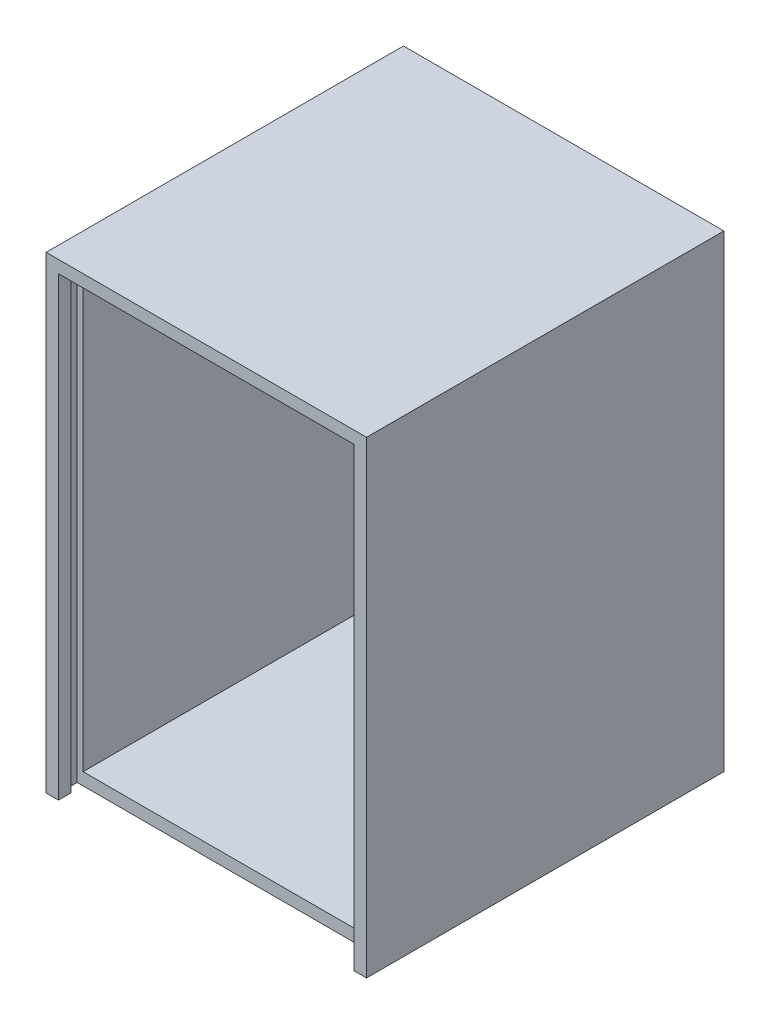
ISO-10303-21;
HEADER;
FILE_DESCRIPTION(('STEP AP214'),'2;1');
FILE_NAME('part.step','',(''),(''),'','','');
FILE_SCHEMA(('AUTOMOTIVE_DESIGN { 1 0 10303 214 1 1 1 1 }'));
ENDSEC;
DATA;
#1=APPLICATION_CONTEXT('core data for automotive mechanical design processes');
#2=APPLICATION_PROTOCOL_DEFINITION('international standard','automotive_design',2000,#1);
#3=PRODUCT_CONTEXT('',#1,'mechanical');
#4=PRODUCT('Part','Part','',(#3));
#5=PRODUCT_RELATED_PRODUCT_CATEGORY('part','',(#4));
#6=PRODUCT_DEFINITION_FORMATION('','',#4);
#7=PRODUCT_DEFINITION_CONTEXT('part definition',#1,'design');
#8=PRODUCT_DEFINITION('design','',#6,#7);
#9=PRODUCT_DEFINITION_SHAPE('','',#8);
#10=(LENGTH_UNIT() NAMED_UNIT(*) SI_UNIT(.MILLI.,.METRE.));
#11=(NAMED_UNIT(*) PLANE_ANGLE_UNIT() SI_UNIT($,.RADIAN.));
#12=(NAMED_UNIT(*) SI_UNIT($,.STERADIAN.) SOLID_ANGLE_UNIT());
#13=UNCERTAINTY_MEASURE_WITH_UNIT(LENGTH_MEASURE(1.E-05),#10,'distance_accuracy_value','');
#14=(GEOMETRIC_REPRESENTATION_CONTEXT(3) GLOBAL_UNCERTAINTY_ASSIGNED_CONTEXT((#13)) GLOBAL_UNIT_ASSIGNED_CONTEXT((#10,
#11,#12)) REPRESENTATION_CONTEXT('',''));
#15=CARTESIAN_POINT('',(0.,0.,0.));
#16=DIRECTION('',(0.,0.,1.));
#17=DIRECTION('',(1.,0.,0.));
#18=AXIS2_PLACEMENT_3D('',#15,#16,#17);
#19=CARTESIAN_POINT('',(5.00000000000002,-5.,135.));
#20=DIRECTION('',(0.,-1.,0.));
#21=DIRECTION('',(1.,0.,0.));
#22=AXIS2_PLACEMENT_3D('',#19,#20,#21);
#23=PLANE('',#22);
#24=DIRECTION('',(-1.,0.,0.));
#25=VECTOR('',#24,1.);
#26=CARTESIAN_POINT('',(5.00000000000003,-5.,140.));
#27=LINE('',#26,#25);
#28=CARTESIAN_POINT('',(125.,-5.,140.));
#29=VERTEX_POINT('',#28);
#30=CARTESIAN_POINT('',(5.00000000000003,-5.,140.));
#31=VERTEX_POINT('',#30);
#32=EDGE_CURVE('E163',#29,#31,#27,.T.);
#33=ORIENTED_EDGE('',*,*,#32,.F.);
#34=DIRECTION('',(0.,0.,-1.));
#35=VECTOR('',#34,1.);
#36=CARTESIAN_POINT('',(125.,-5.,135.));
#37=LINE('',#36,#35);
#38=CARTESIAN_POINT('',(125.,-5.,145.));
#39=VERTEX_POINT('',#38);
#40=EDGE_CURVE('E187',#39,#29,#37,.T.);
#41=ORIENTED_EDGE('',*,*,#40,.F.);
#42=DIRECTION('',(1.,0.,0.));
#43=VECTOR('',#42,1.);
#44=CARTESIAN_POINT('',(125.,-5.,145.));
#45=LINE('',#44,#43);
#46=CARTESIAN_POINT('',(5.00000000000002,-5.,145.));
#47=VERTEX_POINT('',#46);
#48=EDGE_CURVE('E344',#47,#39,#45,.T.);
#49=ORIENTED_EDGE('',*,*,#48,.F.);
#50=DIRECTION('',(0.,0.,-1.));
#51=VECTOR('',#50,1.);
#52=CARTESIAN_POINT('',(5.00000000000002,-5.,135.));
#53=LINE('',#52,#51);
#54=EDGE_CURVE('E177',#47,#31,#53,.T.);
#55=ORIENTED_EDGE('',*,*,#54,.T.);
#56=EDGE_LOOP('',(#33,#41,#49,#55));
#57=FACE_BOUND('',#56,.T.);
#58=ADVANCED_FACE('F45',(#57),#23,.T.);
#59=CARTESIAN_POINT('',(125.,-185.,135.));
#60=DIRECTION('',(-1.,0.,0.));
#61=DIRECTION('',(0.,0.,1.));
#62=AXIS2_PLACEMENT_3D('',#59,#60,#61);
#63=PLANE('',#62);
#64=DIRECTION('',(0.,-1.,0.));
#65=VECTOR('',#64,1.);
#66=CARTESIAN_POINT('',(125.,-2.59999999999999,140.));
#67=LINE('',#66,#65);
#68=CARTESIAN_POINT('',(125.,-190.,140.));
#69=VERTEX_POINT('',#68);
#70=EDGE_CURVE('E378',#29,#69,#67,.T.);
#71=ORIENTED_EDGE('',*,*,#70,.T.);
#72=DIRECTION('',(0.,0.,-1.));
#73=VECTOR('',#72,1.);
#74=CARTESIAN_POINT('',(125.,-190.,145.));
#75=LINE('',#74,#73);
#76=CARTESIAN_POINT('',(125.,-190.,145.));
#77=VERTEX_POINT('',#76);
#78=EDGE_CURVE('E249',#77,#69,#75,.T.);
#79=ORIENTED_EDGE('',*,*,#78,.F.);
#80=DIRECTION('',(0.,-1.,0.));
#81=VECTOR('',#80,1.);
#82=CARTESIAN_POINT('',(125.,-185.,145.));
#83=LINE('',#82,#81);
#84=EDGE_CURVE('E356',#39,#77,#83,.T.);
#85=ORIENTED_EDGE('',*,*,#84,.F.);
#86=ORIENTED_EDGE('',*,*,#40,.T.);
#87=EDGE_LOOP('',(#71,#79,#85,#86));
#88=FACE_BOUND('',#87,.T.);
#89=ADVANCED_FACE('F294',(#88),#63,.T.);
#90=CARTESIAN_POINT('',(5.00000000000002,-185.,135.));
#91=DIRECTION('',(1.,0.,0.));
#92=DIRECTION('',(0.,0.,-1.));
#93=AXIS2_PLACEMENT_3D('',#90,#91,#92);
#94=PLANE('',#93);
#95=DIRECTION('',(0.,1.,0.));
#96=VECTOR('',#95,1.);
#97=CARTESIAN_POINT('',(5.00000000000002,-185.,135.));
#98=LINE('',#97,#96);
#99=CARTESIAN_POINT('',(5.00000000000003,-185.,135.));
#100=VERTEX_POINT('',#99);
#101=CARTESIAN_POINT('',(5.00000000000003,-5.,135.));
#102=VERTEX_POINT('',#101);
#103=EDGE_CURVE('E11',#100,#102,#98,.T.);
#104=ORIENTED_EDGE('',*,*,#103,.F.);
#105=DIRECTION('',(0.,0.,-1.));
#106=VECTOR('',#105,1.);
#107=CARTESIAN_POINT('',(5.00000000000002,-185.,135.));
#108=LINE('',#107,#106);
#109=CARTESIAN_POINT('',(5.00000000000002,-185.,5.));
#110=VERTEX_POINT('',#109);
#111=EDGE_CURVE('E178',#100,#110,#108,.T.);
#112=ORIENTED_EDGE('',*,*,#111,.T.);
#113=DIRECTION('',(0.,-1.,0.));
#114=VECTOR('',#113,1.);
#115=CARTESIAN_POINT('',(5.00000000000002,-185.,5.));
#116=LINE('',#115,#114);
#117=CARTESIAN_POINT('',(5.00000000000002,-5.,5.));
#118=VERTEX_POINT('',#117);
#119=EDGE_CURVE('E175',#118,#110,#116,.T.);
#120=ORIENTED_EDGE('',*,*,#119,.F.);
#121=EDGE_CURVE('E69',#102,#118,#53,.T.);
#122=ORIENTED_EDGE('',*,*,#121,.F.);
#123=EDGE_LOOP('',(#104,#112,#120,#122));
#124=FACE_BOUND('',#123,.T.);
#125=ADVANCED_FACE('F174',(#124),#94,.T.);
#126=CARTESIAN_POINT('',(0.,0.,5.));
#127=DIRECTION('',(1.,0.,0.));
#128=DIRECTION('',(0.,1.,0.));
#129=AXIS2_PLACEMENT_3D('',#126,#127,#128);
#130=PLANE('',#129);
#131=DIRECTION('',(0.,-1.,0.));
#132=VECTOR('',#131,1.);
#133=CARTESIAN_POINT('',(0.,0.,0.));
#134=LINE('',#133,#132);
#135=CARTESIAN_POINT('',(0.,0.,0.));
#136=VERTEX_POINT('',#135);
#137=CARTESIAN_POINT('',(0.,-190.,0.));
#138=VERTEX_POINT('',#137);
#139=EDGE_CURVE('E194',#136,#138,#134,.T.);
#140=ORIENTED_EDGE('',*,*,#139,.T.);
#141=DIRECTION('',(0.,0.,-1.));
#142=VECTOR('',#141,1.);
#143=CARTESIAN_POINT('',(0.,-190.,5.));
#144=LINE('',#143,#142);
#145=CARTESIAN_POINT('',(0.,-190.,145.));
#146=VERTEX_POINT('',#145);
#147=EDGE_CURVE('E219',#146,#138,#144,.T.);
#148=ORIENTED_EDGE('',*,*,#147,.F.);
#149=DIRECTION('',(0.,-1.,0.));
#150=VECTOR('',#149,1.);
#151=CARTESIAN_POINT('',(0.,-190.,145.));
#152=LINE('',#151,#150);
#153=CARTESIAN_POINT('',(0.,0.,145.));
#154=VERTEX_POINT('',#153);
#155=EDGE_CURVE('E256',#154,#146,#152,.T.);
#156=ORIENTED_EDGE('',*,*,#155,.F.);
#157=DIRECTION('',(0.,0.,-1.));
#158=VECTOR('',#157,1.);
#159=CARTESIAN_POINT('',(0.,0.,5.));
#160=LINE('',#159,#158);
#161=EDGE_CURVE('E207',#154,#136,#160,.T.);
#162=ORIENTED_EDGE('',*,*,#161,.T.);
#163=EDGE_LOOP('',(#140,#148,#156,#162));
#164=FACE_BOUND('',#163,.T.);
#165=ADVANCED_FACE('F47',(#164),#130,.F.);
#166=CARTESIAN_POINT('',(0.,-190.,5.));
#167=DIRECTION('',(0.,1.,0.));
#168=DIRECTION('',(0.,0.,1.));
#169=AXIS2_PLACEMENT_3D('',#166,#167,#168);
#170=PLANE('',#169);
#171=DIRECTION('',(1.,0.,0.));
#172=VECTOR('',#171,1.);
#173=CARTESIAN_POINT('',(0.,-190.,135.));
#174=LINE('',#173,#172);
#175=CARTESIAN_POINT('',(2.60000000000003,-190.,135.));
#176=VERTEX_POINT('',#175);
#177=CARTESIAN_POINT('',(127.4,-190.,135.));
#178=VERTEX_POINT('',#177);
#179=EDGE_CURVE('E191',#176,#178,#174,.T.);
#180=ORIENTED_EDGE('',*,*,#179,.F.);
#181=DIRECTION('',(0.,0.,-1.));
#182=VECTOR('',#181,1.);
#183=CARTESIAN_POINT('',(2.60000000000003,-190.,140.));
#184=LINE('',#183,#182);
#185=CARTESIAN_POINT('',(2.60000000000003,-190.,140.));
#186=VERTEX_POINT('',#185);
#187=EDGE_CURVE('E239',#186,#176,#184,.T.);
#188=ORIENTED_EDGE('',*,*,#187,.F.);
#189=DIRECTION('',(-1.,0.,0.));
#190=VECTOR('',#189,1.);
#191=CARTESIAN_POINT('',(5.00000000000002,-190.,140.));
#192=LINE('',#191,#190);
#193=CARTESIAN_POINT('',(5.00000000000002,-190.,140.));
#194=VERTEX_POINT('',#193);
#195=EDGE_CURVE('E228',#194,#186,#192,.T.);
#196=ORIENTED_EDGE('',*,*,#195,.F.);
#197=DIRECTION('',(0.,0.,-1.));
#198=VECTOR('',#197,1.);
#199=CARTESIAN_POINT('',(5.00000000000002,-190.,145.));
#200=LINE('',#199,#198);
#201=CARTESIAN_POINT('',(5.00000000000002,-190.,145.));
#202=VERTEX_POINT('',#201);
#203=EDGE_CURVE('E237',#202,#194,#200,.T.);
#204=ORIENTED_EDGE('',*,*,#203,.F.);
#205=DIRECTION('',(1.,0.,0.));
#206=VECTOR('',#205,1.);
#207=CARTESIAN_POINT('',(5.00000000000002,-190.,145.));
#208=LINE('',#207,#206);
#209=EDGE_CURVE('E338',#146,#202,#208,.T.);
#210=ORIENTED_EDGE('',*,*,#209,.F.);
#211=ORIENTED_EDGE('',*,*,#147,.T.);
#212=DIRECTION('',(1.,0.,0.));
#213=VECTOR('',#212,1.);
#214=CARTESIAN_POINT('',(0.,-190.,0.));
#215=LINE('',#214,#213);
#216=CARTESIAN_POINT('',(130.,-190.,0.));
#217=VERTEX_POINT('',#216);
#218=EDGE_CURVE('E198',#138,#217,#215,.T.);
#219=ORIENTED_EDGE('',*,*,#218,.T.);
#220=DIRECTION('',(0.,0.,-1.));
#221=VECTOR('',#220,1.);
#222=CARTESIAN_POINT('',(130.,-190.,5.));
#223=LINE('',#222,#221);
#224=CARTESIAN_POINT('',(130.,-190.,145.));
#225=VERTEX_POINT('',#224);
#226=EDGE_CURVE('E215',#225,#217,#223,.T.);
#227=ORIENTED_EDGE('',*,*,#226,.F.);
#228=DIRECTION('',(1.,0.,0.));
#229=VECTOR('',#228,1.);
#230=CARTESIAN_POINT('',(130.,-190.,145.));
#231=LINE('',#230,#229);
#232=EDGE_CURVE('E359',#77,#225,#231,.T.);
#233=ORIENTED_EDGE('',*,*,#232,.F.);
#234=ORIENTED_EDGE('',*,*,#78,.T.);
#235=DIRECTION('',(-1.,0.,0.));
#236=VECTOR('',#235,1.);
#237=CARTESIAN_POINT('',(125.,-190.,140.));
#238=LINE('',#237,#236);
#239=CARTESIAN_POINT('',(127.4,-190.,140.));
#240=VERTEX_POINT('',#239);
#241=EDGE_CURVE('E381',#240,#69,#238,.T.);
#242=ORIENTED_EDGE('',*,*,#241,.F.);
#243=DIRECTION('',(0.,0.,1.));
#244=VECTOR('',#243,1.);
#245=CARTESIAN_POINT('',(127.4,-190.,135.));
#246=LINE('',#245,#244);
#247=EDGE_CURVE('E241',#178,#240,#246,.T.);
#248=ORIENTED_EDGE('',*,*,#247,.F.);
#249=EDGE_LOOP('',(#180,#188,#196,#204,#210,#211,#219,#227,#233,#234,#242,#248));
#250=FACE_BOUND('',#249,.T.);
#251=ADVANCED_FACE('F235',(#250),#170,.F.);
#252=CARTESIAN_POINT('',(130.,0.,5.));
#253=DIRECTION('',(-1.,0.,0.));
#254=DIRECTION('',(0.,-1.,0.));
#255=AXIS2_PLACEMENT_3D('',#252,#253,#254);
#256=PLANE('',#255);
#257=DIRECTION('',(0.,1.,0.));
#258=VECTOR('',#257,1.);
#259=CARTESIAN_POINT('',(130.,0.,0.));
#260=LINE('',#259,#258);
#261=CARTESIAN_POINT('',(130.,0.,0.));
#262=VERTEX_POINT('',#261);
#263=EDGE_CURVE('E201',#217,#262,#260,.T.);
#264=ORIENTED_EDGE('',*,*,#263,.T.);
#265=DIRECTION('',(0.,0.,-1.));
#266=VECTOR('',#265,1.);
#267=CARTESIAN_POINT('',(130.,0.,5.));
#268=LINE('',#267,#266);
#269=CARTESIAN_POINT('',(130.,0.,145.));
#270=VERTEX_POINT('',#269);
#271=EDGE_CURVE('E211',#270,#262,#268,.T.);
#272=ORIENTED_EDGE('',*,*,#271,.F.);
#273=DIRECTION('',(0.,1.,0.));
#274=VECTOR('',#273,1.);
#275=CARTESIAN_POINT('',(130.,0.,145.));
#276=LINE('',#275,#274);
#277=EDGE_CURVE('E363',#225,#270,#276,.T.);
#278=ORIENTED_EDGE('',*,*,#277,.F.);
#279=ORIENTED_EDGE('',*,*,#226,.T.);
#280=EDGE_LOOP('',(#264,#272,#278,#279));
#281=FACE_BOUND('',#280,.T.);
#282=ADVANCED_FACE('F321',(#281),#256,.F.);
#283=CARTESIAN_POINT('',(0.,0.,5.));
#284=DIRECTION('',(0.,-1.,0.));
#285=DIRECTION('',(0.,0.,-1.));
#286=AXIS2_PLACEMENT_3D('',#283,#284,#285);
#287=PLANE('',#286);
#288=DIRECTION('',(-1.,0.,0.));
#289=VECTOR('',#288,1.);
#290=CARTESIAN_POINT('',(0.,0.,0.));
#291=LINE('',#290,#289);
#292=EDGE_CURVE('E204',#262,#136,#291,.T.);
#293=ORIENTED_EDGE('',*,*,#292,.T.);
#294=ORIENTED_EDGE('',*,*,#161,.F.);
#295=DIRECTION('',(-1.,0.,0.));
#296=VECTOR('',#295,1.);
#297=CARTESIAN_POINT('',(0.,0.,145.));
#298=LINE('',#297,#296);
#299=EDGE_CURVE('E367',#270,#154,#298,.T.);
#300=ORIENTED_EDGE('',*,*,#299,.F.);
#301=ORIENTED_EDGE('',*,*,#271,.T.);
#302=EDGE_LOOP('',(#293,#294,#300,#301));
#303=FACE_BOUND('',#302,.T.);
#304=ADVANCED_FACE('F316',(#303),#287,.F.);
#305=CARTESIAN_POINT('',(0.,0.,0.));
#306=DIRECTION('',(0.,0.,1.));
#307=DIRECTION('',(1.,0.,0.));
#308=AXIS2_PLACEMENT_3D('',#305,#306,#307);
#309=PLANE('',#308);
#310=ORIENTED_EDGE('',*,*,#139,.F.);
#311=ORIENTED_EDGE('',*,*,#292,.F.);
#312=ORIENTED_EDGE('',*,*,#263,.F.);
#313=ORIENTED_EDGE('',*,*,#218,.F.);
#314=EDGE_LOOP('',(#310,#311,#312,#313));
#315=FACE_BOUND('',#314,.T.);
#316=ADVANCED_FACE('F312',(#315),#309,.F.);
#317=CARTESIAN_POINT('',(0.,0.,135.));
#318=DIRECTION('',(0.,0.,1.));
#319=DIRECTION('',(1.,0.,0.));
#320=AXIS2_PLACEMENT_3D('',#317,#318,#319);
#321=PLANE('',#320);
#322=ORIENTED_EDGE('',*,*,#103,.T.);
#323=DIRECTION('',(1.,0.,0.));
#324=VECTOR('',#323,1.);
#325=CARTESIAN_POINT('',(5.00000000000003,-5.,135.));
#326=LINE('',#325,#324);
#327=CARTESIAN_POINT('',(125.,-5.,135.));
#328=VERTEX_POINT('',#327);
#329=EDGE_CURVE('E159',#102,#328,#326,.T.);
#330=ORIENTED_EDGE('',*,*,#329,.T.);
#331=DIRECTION('',(0.,-1.,0.));
#332=VECTOR('',#331,1.);
#333=CARTESIAN_POINT('',(125.,-2.59999999999999,135.));
#334=LINE('',#333,#332);
#335=CARTESIAN_POINT('',(125.,-185.,135.));
#336=VERTEX_POINT('',#335);
#337=EDGE_CURVE('E275',#328,#336,#334,.T.);
#338=ORIENTED_EDGE('',*,*,#337,.T.);
#339=DIRECTION('',(1.,0.,0.));
#340=VECTOR('',#339,1.);
#341=CARTESIAN_POINT('',(5.00000000000002,-185.,135.));
#342=LINE('',#341,#340);
#343=EDGE_CURVE('E169',#100,#336,#342,.T.);
#344=ORIENTED_EDGE('',*,*,#343,.F.);
#345=EDGE_LOOP('',(#322,#330,#338,#344));
#346=FACE_BOUND('',#345,.T.);
#347=ORIENTED_EDGE('',*,*,#179,.T.);
#348=DIRECTION('',(0.,-1.,0.));
#349=VECTOR('',#348,1.);
#350=CARTESIAN_POINT('',(127.4,-2.59999999999999,135.));
#351=LINE('',#350,#349);
#352=CARTESIAN_POINT('',(127.4,-2.59999999999999,135.));
#353=VERTEX_POINT('',#352);
#354=EDGE_CURVE('E394',#353,#178,#351,.T.);
#355=ORIENTED_EDGE('',*,*,#354,.F.);
#356=DIRECTION('',(1.,0.,0.));
#357=VECTOR('',#356,1.);
#358=CARTESIAN_POINT('',(5.00000000000003,-2.59999999999999,135.));
#359=LINE('',#358,#357);
#360=CARTESIAN_POINT('',(2.60000000000003,-2.59999999999999,135.));
#361=VERTEX_POINT('',#360);
#362=EDGE_CURVE('E401',#361,#353,#359,.T.);
#363=ORIENTED_EDGE('',*,*,#362,.F.);
#364=DIRECTION('',(0.,-1.,0.));
#365=VECTOR('',#364,1.);
#366=CARTESIAN_POINT('',(2.60000000000003,-2.59999999999999,135.));
#367=LINE('',#366,#365);
#368=EDGE_CURVE('E340',#361,#176,#367,.T.);
#369=ORIENTED_EDGE('',*,*,#368,.T.);
#370=EDGE_LOOP('',(#347,#355,#363,#369));
#371=FACE_BOUND('',#370,.T.);
#372=ADVANCED_FACE('F166',(#346,#371),#321,.T.);
#373=ORIENTED_EDGE('',*,*,#337,.F.);
#374=CARTESIAN_POINT('',(125.,-5.,5.));
#375=VERTEX_POINT('',#374);
#376=EDGE_CURVE('E61',#328,#375,#37,.T.);
#377=ORIENTED_EDGE('',*,*,#376,.T.);
#378=DIRECTION('',(0.,1.,0.));
#379=VECTOR('',#378,1.);
#380=CARTESIAN_POINT('',(125.,-185.,5.));
#381=LINE('',#380,#379);
#382=CARTESIAN_POINT('',(125.,-185.,5.));
#383=VERTEX_POINT('',#382);
#384=EDGE_CURVE('E248',#383,#375,#381,.T.);
#385=ORIENTED_EDGE('',*,*,#384,.F.);
#386=DIRECTION('',(0.,0.,-1.));
#387=VECTOR('',#386,1.);
#388=CARTESIAN_POINT('',(125.,-185.,135.));
#389=LINE('',#388,#387);
#390=EDGE_CURVE('E183',#336,#383,#389,.T.);
#391=ORIENTED_EDGE('',*,*,#390,.F.);
#392=EDGE_LOOP('',(#373,#377,#385,#391));
#393=FACE_BOUND('',#392,.T.);
#394=ADVANCED_FACE('F274',(#393),#63,.T.);
#395=ORIENTED_EDGE('',*,*,#329,.F.);
#396=ORIENTED_EDGE('',*,*,#121,.T.);
#397=DIRECTION('',(-1.,0.,0.));
#398=VECTOR('',#397,1.);
#399=CARTESIAN_POINT('',(5.00000000000002,-5.,5.));
#400=LINE('',#399,#398);
#401=EDGE_CURVE('E253',#375,#118,#400,.T.);
#402=ORIENTED_EDGE('',*,*,#401,.F.);
#403=ORIENTED_EDGE('',*,*,#376,.F.);
#404=EDGE_LOOP('',(#395,#396,#402,#403));
#405=FACE_BOUND('',#404,.T.);
#406=ADVANCED_FACE('F160',(#405),#23,.T.);
#407=DIRECTION('',(0.,-1.,0.));
#408=VECTOR('',#407,1.);
#409=CARTESIAN_POINT('',(5.00000000000002,-185.,140.));
#410=LINE('',#409,#408);
#411=EDGE_CURVE('E54',#31,#194,#410,.T.);
#412=ORIENTED_EDGE('',*,*,#411,.F.);
#413=ORIENTED_EDGE('',*,*,#54,.F.);
#414=DIRECTION('',(0.,1.,0.));
#415=VECTOR('',#414,1.);
#416=CARTESIAN_POINT('',(5.00000000000002,-5.,145.));
#417=LINE('',#416,#415);
#418=EDGE_CURVE('E245',#202,#47,#417,.T.);
#419=ORIENTED_EDGE('',*,*,#418,.F.);
#420=ORIENTED_EDGE('',*,*,#203,.T.);
#421=EDGE_LOOP('',(#412,#413,#419,#420));
#422=FACE_BOUND('',#421,.T.);
#423=ADVANCED_FACE('F243',(#422),#94,.T.);
#424=CARTESIAN_POINT('',(5.00000000000002,-185.,135.));
#425=DIRECTION('',(0.,1.,0.));
#426=DIRECTION('',(0.,0.,1.));
#427=AXIS2_PLACEMENT_3D('',#424,#425,#426);
#428=PLANE('',#427);
#429=DIRECTION('',(1.,0.,0.));
#430=VECTOR('',#429,1.);
#431=CARTESIAN_POINT('',(5.00000000000002,-185.,5.));
#432=LINE('',#431,#430);
#433=EDGE_CURVE('E261',#110,#383,#432,.T.);
#434=ORIENTED_EDGE('',*,*,#433,.F.);
#435=ORIENTED_EDGE('',*,*,#111,.F.);
#436=ORIENTED_EDGE('',*,*,#343,.T.);
#437=ORIENTED_EDGE('',*,*,#390,.T.);
#438=EDGE_LOOP('',(#434,#435,#436,#437));
#439=FACE_BOUND('',#438,.T.);
#440=ADVANCED_FACE('F273',(#439),#428,.T.);
#441=CARTESIAN_POINT('',(0.,0.,5.));
#442=DIRECTION('',(0.,0.,1.));
#443=DIRECTION('',(1.,0.,0.));
#444=AXIS2_PLACEMENT_3D('',#441,#442,#443);
#445=PLANE('',#444);
#446=ORIENTED_EDGE('',*,*,#384,.T.);
#447=ORIENTED_EDGE('',*,*,#401,.T.);
#448=ORIENTED_EDGE('',*,*,#119,.T.);
#449=ORIENTED_EDGE('',*,*,#433,.T.);
#450=EDGE_LOOP('',(#446,#447,#448,#449));
#451=FACE_BOUND('',#450,.T.);
#452=ADVANCED_FACE('F277',(#451),#445,.T.);
#453=CARTESIAN_POINT('',(0.,0.,145.));
#454=DIRECTION('',(0.,0.,-1.));
#455=DIRECTION('',(-1.,0.,0.));
#456=AXIS2_PLACEMENT_3D('',#453,#454,#455);
#457=PLANE('',#456);
#458=ORIENTED_EDGE('',*,*,#209,.T.);
#459=ORIENTED_EDGE('',*,*,#418,.T.);
#460=ORIENTED_EDGE('',*,*,#48,.T.);
#461=ORIENTED_EDGE('',*,*,#84,.T.);
#462=ORIENTED_EDGE('',*,*,#232,.T.);
#463=ORIENTED_EDGE('',*,*,#277,.T.);
#464=ORIENTED_EDGE('',*,*,#299,.T.);
#465=ORIENTED_EDGE('',*,*,#155,.T.);
#466=EDGE_LOOP('',(#458,#459,#460,#461,#462,#463,#464,#465));
#467=FACE_BOUND('',#466,.T.);
#468=ADVANCED_FACE('F279',(#467),#457,.F.);
#469=CARTESIAN_POINT('',(2.60000000000003,-2.59999999999999,140.));
#470=DIRECTION('',(-1.,0.,0.));
#471=DIRECTION('',(0.,0.,1.));
#472=AXIS2_PLACEMENT_3D('',#469,#470,#471);
#473=PLANE('',#472);
#474=ORIENTED_EDGE('',*,*,#187,.T.);
#475=ORIENTED_EDGE('',*,*,#368,.F.);
#476=DIRECTION('',(0.,0.,-1.));
#477=VECTOR('',#476,1.);
#478=CARTESIAN_POINT('',(2.60000000000003,-2.59999999999999,140.));
#479=LINE('',#478,#477);
#480=CARTESIAN_POINT('',(2.60000000000003,-2.59999999999999,140.));
#481=VERTEX_POINT('',#480);
#482=EDGE_CURVE('E408',#481,#361,#479,.T.);
#483=ORIENTED_EDGE('',*,*,#482,.F.);
#484=DIRECTION('',(0.,-1.,0.));
#485=VECTOR('',#484,1.);
#486=CARTESIAN_POINT('',(2.60000000000003,-2.59999999999999,140.));
#487=LINE('',#486,#485);
#488=EDGE_CURVE('E347',#481,#186,#487,.T.);
#489=ORIENTED_EDGE('',*,*,#488,.T.);
#490=EDGE_LOOP('',(#474,#475,#483,#489));
#491=FACE_BOUND('',#490,.T.);
#492=ADVANCED_FACE('F286',(#491),#473,.F.);
#493=CARTESIAN_POINT('',(5.00000000000002,-2.59999999999999,140.));
#494=DIRECTION('',(0.,0.,1.));
#495=DIRECTION('',(1.,0.,0.));
#496=AXIS2_PLACEMENT_3D('',#493,#494,#495);
#497=PLANE('',#496);
#498=ORIENTED_EDGE('',*,*,#195,.T.);
#499=ORIENTED_EDGE('',*,*,#488,.F.);
#500=DIRECTION('',(-1.,0.,0.));
#501=VECTOR('',#500,1.);
#502=CARTESIAN_POINT('',(5.00000000000002,-2.59999999999999,140.));
#503=LINE('',#502,#501);
#504=CARTESIAN_POINT('',(127.4,-2.59999999999999,140.));
#505=VERTEX_POINT('',#504);
#506=EDGE_CURVE('E404',#505,#481,#503,.T.);
#507=ORIENTED_EDGE('',*,*,#506,.F.);
#508=DIRECTION('',(0.,-1.,0.));
#509=VECTOR('',#508,1.);
#510=CARTESIAN_POINT('',(127.4,-2.59999999999999,140.));
#511=LINE('',#510,#509);
#512=EDGE_CURVE('E391',#505,#240,#511,.T.);
#513=ORIENTED_EDGE('',*,*,#512,.T.);
#514=ORIENTED_EDGE('',*,*,#241,.T.);
#515=ORIENTED_EDGE('',*,*,#70,.F.);
#516=ORIENTED_EDGE('',*,*,#32,.T.);
#517=ORIENTED_EDGE('',*,*,#411,.T.);
#518=EDGE_LOOP('',(#498,#499,#507,#513,#514,#515,#516,#517));
#519=FACE_BOUND('',#518,.T.);
#520=ADVANCED_FACE('F227',(#519),#497,.F.);
#521=CARTESIAN_POINT('',(0.,-2.59999999999999,0.));
#522=DIRECTION('',(0.,1.,0.));
#523=DIRECTION('',(0.,0.,1.));
#524=AXIS2_PLACEMENT_3D('',#521,#522,#523);
#525=PLANE('',#524);
#526=ORIENTED_EDGE('',*,*,#362,.T.);
#527=DIRECTION('',(0.,0.,1.));
#528=VECTOR('',#527,1.);
#529=CARTESIAN_POINT('',(127.4,-2.59999999999999,135.));
#530=LINE('',#529,#528);
#531=EDGE_CURVE('E350',#353,#505,#530,.T.);
#532=ORIENTED_EDGE('',*,*,#531,.T.);
#533=ORIENTED_EDGE('',*,*,#506,.T.);
#534=ORIENTED_EDGE('',*,*,#482,.T.);
#535=EDGE_LOOP('',(#526,#532,#533,#534));
#536=FACE_BOUND('',#535,.T.);
#537=ADVANCED_FACE('F417',(#536),#525,.F.);
#538=CARTESIAN_POINT('',(127.4,-2.59999999999999,135.));
#539=DIRECTION('',(1.,0.,0.));
#540=DIRECTION('',(0.,0.,-1.));
#541=AXIS2_PLACEMENT_3D('',#538,#539,#540);
#542=PLANE('',#541);
#543=ORIENTED_EDGE('',*,*,#247,.T.);
#544=ORIENTED_EDGE('',*,*,#512,.F.);
#545=ORIENTED_EDGE('',*,*,#531,.F.);
#546=ORIENTED_EDGE('',*,*,#354,.T.);
#547=EDGE_LOOP('',(#543,#544,#545,#546));
#548=FACE_BOUND('',#547,.T.);
#549=ADVANCED_FACE('F423',(#548),#542,.F.);
#550=CLOSED_SHELL('',(#58,#89,#125,#165,#251,#282,#304,#316,#372,#394,#406,#423,#440,#452,#468,
#492,#520,#537,#549));
#551=MANIFOLD_SOLID_BREP('B2',#550);
#552=ADVANCED_BREP_SHAPE_REPRESENTATION('',(#18,#551),#14);
#553=SHAPE_DEFINITION_REPRESENTATION(#9,#552);
ENDSEC;
END-ISO-10303-21;
